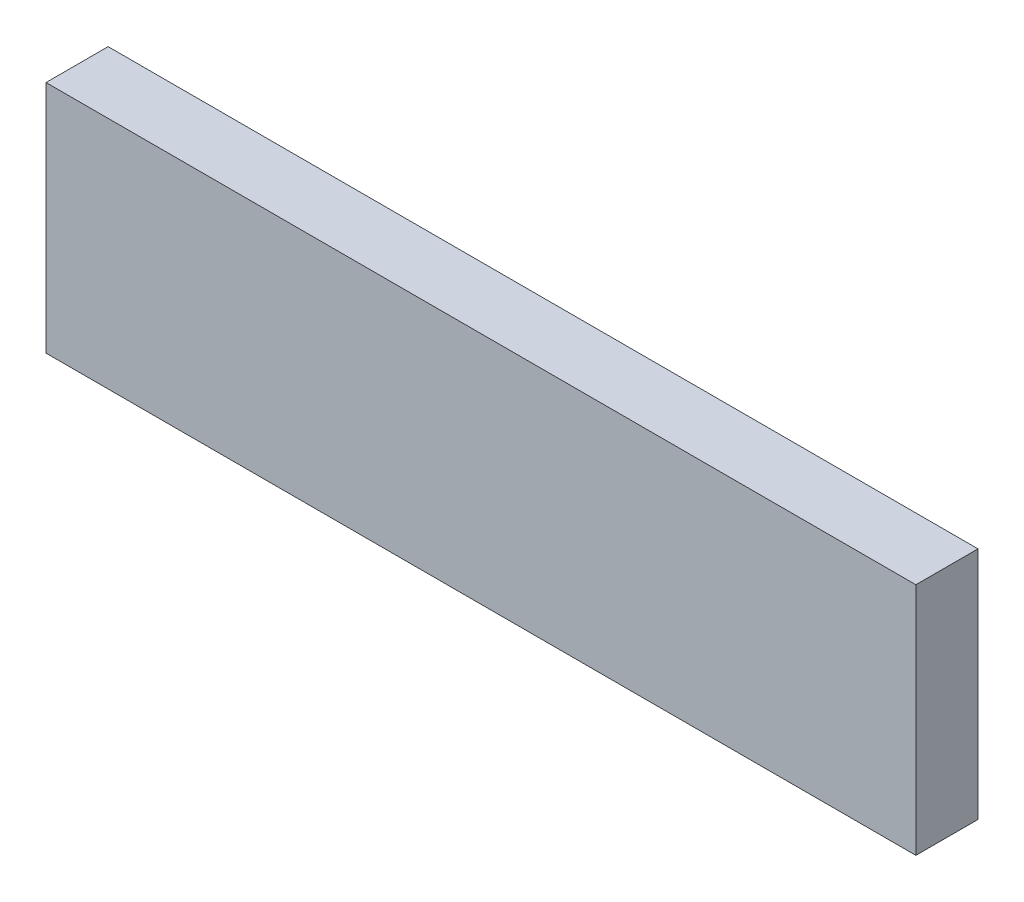
ISO-10303-21;
HEADER;
FILE_DESCRIPTION(('STEP AP214'),'2;1');
FILE_NAME('part.step','',(''),(''),'','','');
FILE_SCHEMA(('AUTOMOTIVE_DESIGN { 1 0 10303 214 1 1 1 1 }'));
ENDSEC;
DATA;
#1=APPLICATION_CONTEXT('core data for automotive mechanical design processes');
#2=APPLICATION_PROTOCOL_DEFINITION('international standard','automotive_design',2000,#1);
#3=PRODUCT_CONTEXT('',#1,'mechanical');
#4=PRODUCT('Part','Part','',(#3));
#5=PRODUCT_RELATED_PRODUCT_CATEGORY('part','',(#4));
#6=PRODUCT_DEFINITION_FORMATION('','',#4);
#7=PRODUCT_DEFINITION_CONTEXT('part definition',#1,'design');
#8=PRODUCT_DEFINITION('design','',#6,#7);
#9=PRODUCT_DEFINITION_SHAPE('','',#8);
#10=(LENGTH_UNIT() NAMED_UNIT(*) SI_UNIT(.MILLI.,.METRE.));
#11=(NAMED_UNIT(*) PLANE_ANGLE_UNIT() SI_UNIT($,.RADIAN.));
#12=(NAMED_UNIT(*) SI_UNIT($,.STERADIAN.) SOLID_ANGLE_UNIT());
#13=UNCERTAINTY_MEASURE_WITH_UNIT(LENGTH_MEASURE(1.E-05),#10,'distance_accuracy_value','');
#14=(GEOMETRIC_REPRESENTATION_CONTEXT(3) GLOBAL_UNCERTAINTY_ASSIGNED_CONTEXT((#13)) GLOBAL_UNIT_ASSIGNED_CONTEXT((#10,
#11,#12)) REPRESENTATION_CONTEXT('',''));
#15=CARTESIAN_POINT('',(0.,0.,0.));
#16=DIRECTION('',(0.,0.,1.));
#17=DIRECTION('',(1.,0.,0.));
#18=AXIS2_PLACEMENT_3D('',#15,#16,#17);
#19=CARTESIAN_POINT('',(0.,0.,5.));
#20=DIRECTION('',(1.,0.,0.));
#21=DIRECTION('',(0.,0.,-1.));
#22=AXIS2_PLACEMENT_3D('',#19,#20,#21);
#23=PLANE('',#22);
#24=DIRECTION('',(0.,-1.,0.));
#25=VECTOR('',#24,1.);
#26=CARTESIAN_POINT('',(0.,0.,0.));
#27=LINE('',#26,#25);
#28=CARTESIAN_POINT('',(0.,18.8611524163569,0.));
#29=VERTEX_POINT('',#28);
#30=CARTESIAN_POINT('',(0.,0.,0.));
#31=VERTEX_POINT('',#30);
#32=EDGE_CURVE('E98',#29,#31,#27,.T.);
#33=ORIENTED_EDGE('',*,*,#32,.T.);
#34=DIRECTION('',(0.,0.,-1.));
#35=VECTOR('',#34,1.);
#36=CARTESIAN_POINT('',(0.,0.,5.));
#37=LINE('',#36,#35);
#38=CARTESIAN_POINT('',(0.,0.,5.));
#39=VERTEX_POINT('',#38);
#40=EDGE_CURVE('E11',#39,#31,#37,.T.);
#41=ORIENTED_EDGE('',*,*,#40,.F.);
#42=DIRECTION('',(0.,-1.,0.));
#43=VECTOR('',#42,1.);
#44=CARTESIAN_POINT('',(0.,0.,5.));
#45=LINE('',#44,#43);
#46=CARTESIAN_POINT('',(0.,18.8611524163569,5.));
#47=VERTEX_POINT('',#46);
#48=EDGE_CURVE('E86',#47,#39,#45,.T.);
#49=ORIENTED_EDGE('',*,*,#48,.F.);
#50=DIRECTION('',(0.,0.,-1.));
#51=VECTOR('',#50,1.);
#52=CARTESIAN_POINT('',(0.,18.8611524163569,5.));
#53=LINE('',#52,#51);
#54=EDGE_CURVE('E94',#47,#29,#53,.T.);
#55=ORIENTED_EDGE('',*,*,#54,.T.);
#56=EDGE_LOOP('',(#33,#41,#49,#55));
#57=FACE_BOUND('',#56,.T.);
#58=ADVANCED_FACE('F35',(#57),#23,.F.);
#59=CARTESIAN_POINT('',(0.,0.,5.));
#60=DIRECTION('',(0.,1.,0.));
#61=DIRECTION('',(0.,0.,1.));
#62=AXIS2_PLACEMENT_3D('',#59,#60,#61);
#63=PLANE('',#62);
#64=DIRECTION('',(1.,0.,0.));
#65=VECTOR('',#64,1.);
#66=CARTESIAN_POINT('',(0.,0.,0.));
#67=LINE('',#66,#65);
#68=CARTESIAN_POINT('',(70.,0.,0.));
#69=VERTEX_POINT('',#68);
#70=EDGE_CURVE('E90',#31,#69,#67,.T.);
#71=ORIENTED_EDGE('',*,*,#70,.T.);
#72=DIRECTION('',(0.,0.,-1.));
#73=VECTOR('',#72,1.);
#74=CARTESIAN_POINT('',(70.,0.,5.));
#75=LINE('',#74,#73);
#76=CARTESIAN_POINT('',(70.,0.,5.));
#77=VERTEX_POINT('',#76);
#78=EDGE_CURVE('E43',#77,#69,#75,.T.);
#79=ORIENTED_EDGE('',*,*,#78,.F.);
#80=DIRECTION('',(1.,0.,0.));
#81=VECTOR('',#80,1.);
#82=CARTESIAN_POINT('',(0.,0.,5.));
#83=LINE('',#82,#81);
#84=EDGE_CURVE('E81',#39,#77,#83,.T.);
#85=ORIENTED_EDGE('',*,*,#84,.F.);
#86=ORIENTED_EDGE('',*,*,#40,.T.);
#87=EDGE_LOOP('',(#71,#79,#85,#86));
#88=FACE_BOUND('',#87,.T.);
#89=ADVANCED_FACE('F89',(#88),#63,.F.);
#90=CARTESIAN_POINT('',(70.,0.,5.));
#91=DIRECTION('',(-1.,0.,0.));
#92=DIRECTION('',(0.,0.,1.));
#93=AXIS2_PLACEMENT_3D('',#90,#91,#92);
#94=PLANE('',#93);
#95=DIRECTION('',(0.,1.,0.));
#96=VECTOR('',#95,1.);
#97=CARTESIAN_POINT('',(70.,0.,0.));
#98=LINE('',#97,#96);
#99=CARTESIAN_POINT('',(70.,18.8611524163569,0.));
#100=VERTEX_POINT('',#99);
#101=EDGE_CURVE('E68',#69,#100,#98,.T.);
#102=ORIENTED_EDGE('',*,*,#101,.T.);
#103=DIRECTION('',(0.,0.,-1.));
#104=VECTOR('',#103,1.);
#105=CARTESIAN_POINT('',(70.,18.8611524163569,5.));
#106=LINE('',#105,#104);
#107=CARTESIAN_POINT('',(70.,18.8611524163569,5.));
#108=VERTEX_POINT('',#107);
#109=EDGE_CURVE('E91',#108,#100,#106,.T.);
#110=ORIENTED_EDGE('',*,*,#109,.F.);
#111=DIRECTION('',(0.,1.,0.));
#112=VECTOR('',#111,1.);
#113=CARTESIAN_POINT('',(70.,0.,5.));
#114=LINE('',#113,#112);
#115=EDGE_CURVE('E84',#77,#108,#114,.T.);
#116=ORIENTED_EDGE('',*,*,#115,.F.);
#117=ORIENTED_EDGE('',*,*,#78,.T.);
#118=EDGE_LOOP('',(#102,#110,#116,#117));
#119=FACE_BOUND('',#118,.T.);
#120=ADVANCED_FACE('F92',(#119),#94,.F.);
#121=CARTESIAN_POINT('',(0.,18.8611524163569,5.));
#122=DIRECTION('',(0.,-1.,0.));
#123=DIRECTION('',(0.,0.,-1.));
#124=AXIS2_PLACEMENT_3D('',#121,#122,#123);
#125=PLANE('',#124);
#126=DIRECTION('',(-1.,0.,0.));
#127=VECTOR('',#126,1.);
#128=CARTESIAN_POINT('',(0.,18.8611524163569,0.));
#129=LINE('',#128,#127);
#130=EDGE_CURVE('E74',#100,#29,#129,.T.);
#131=ORIENTED_EDGE('',*,*,#130,.T.);
#132=ORIENTED_EDGE('',*,*,#54,.F.);
#133=DIRECTION('',(-1.,0.,0.));
#134=VECTOR('',#133,1.);
#135=CARTESIAN_POINT('',(0.,18.8611524163569,5.));
#136=LINE('',#135,#134);
#137=EDGE_CURVE('E51',#108,#47,#136,.T.);
#138=ORIENTED_EDGE('',*,*,#137,.F.);
#139=ORIENTED_EDGE('',*,*,#109,.T.);
#140=EDGE_LOOP('',(#131,#132,#138,#139));
#141=FACE_BOUND('',#140,.T.);
#142=ADVANCED_FACE('F105',(#141),#125,.F.);
#143=CARTESIAN_POINT('',(0.,0.,5.));
#144=DIRECTION('',(0.,0.,-1.));
#145=DIRECTION('',(-1.,0.,0.));
#146=AXIS2_PLACEMENT_3D('',#143,#144,#145);
#147=PLANE('',#146);
#148=ORIENTED_EDGE('',*,*,#48,.T.);
#149=ORIENTED_EDGE('',*,*,#84,.T.);
#150=ORIENTED_EDGE('',*,*,#115,.T.);
#151=ORIENTED_EDGE('',*,*,#137,.T.);
#152=EDGE_LOOP('',(#148,#149,#150,#151));
#153=FACE_BOUND('',#152,.T.);
#154=ADVANCED_FACE('F82',(#153),#147,.F.);
#155=CARTESIAN_POINT('',(0.,0.,0.));
#156=DIRECTION('',(0.,0.,-1.));
#157=DIRECTION('',(-1.,0.,0.));
#158=AXIS2_PLACEMENT_3D('',#155,#156,#157);
#159=PLANE('',#158);
#160=ORIENTED_EDGE('',*,*,#32,.F.);
#161=ORIENTED_EDGE('',*,*,#130,.F.);
#162=ORIENTED_EDGE('',*,*,#101,.F.);
#163=ORIENTED_EDGE('',*,*,#70,.F.);
#164=EDGE_LOOP('',(#160,#161,#162,#163));
#165=FACE_BOUND('',#164,.T.);
#166=ADVANCED_FACE('F108',(#165),#159,.T.);
#167=CLOSED_SHELL('',(#58,#89,#120,#142,#154,#166));
#168=MANIFOLD_SOLID_BREP('B2',#167);
#169=ADVANCED_BREP_SHAPE_REPRESENTATION('',(#18,#168),#14);
#170=SHAPE_DEFINITION_REPRESENTATION(#9,#169);
ENDSEC;
END-ISO-10303-21;
